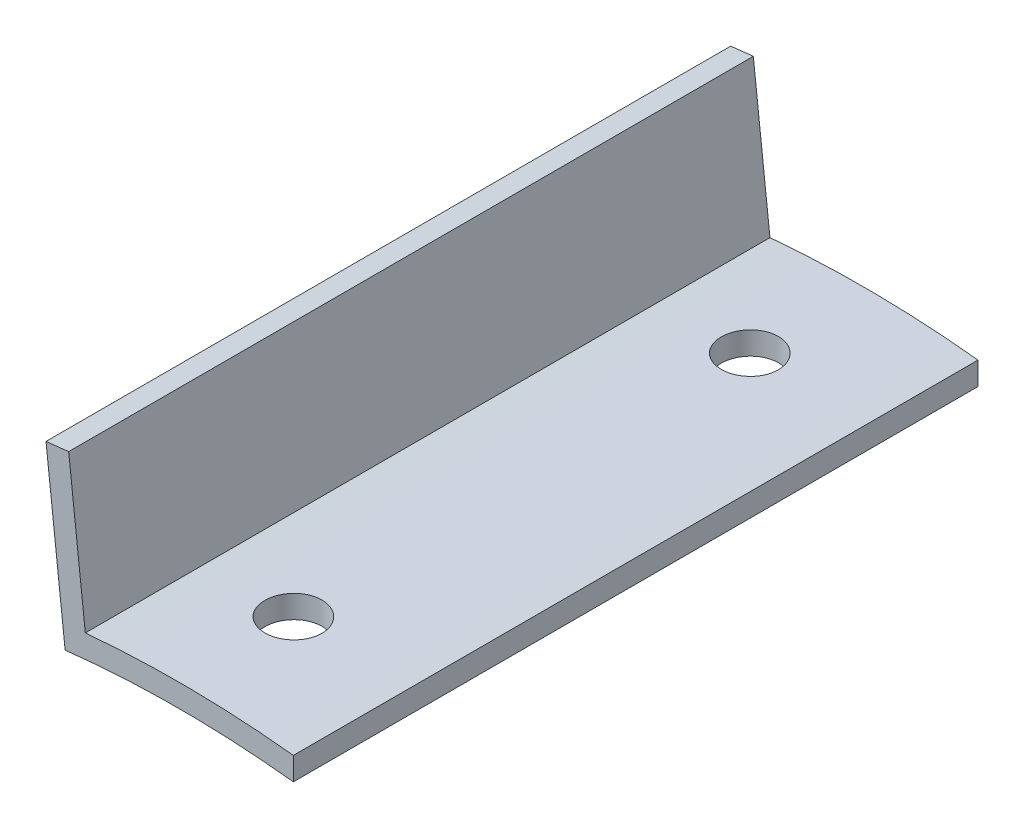
ISO-10303-21;
HEADER;
FILE_DESCRIPTION(('STEP AP214'),'2;1');
FILE_NAME('part.step','',(''),(''),'','','');
FILE_SCHEMA(('AUTOMOTIVE_DESIGN { 1 0 10303 214 1 1 1 1 }'));
ENDSEC;
DATA;
#1=APPLICATION_CONTEXT('core data for automotive mechanical design processes');
#2=APPLICATION_PROTOCOL_DEFINITION('international standard','automotive_design',2000,#1);
#3=PRODUCT_CONTEXT('',#1,'mechanical');
#4=PRODUCT('Part','Part','',(#3));
#5=PRODUCT_RELATED_PRODUCT_CATEGORY('part','',(#4));
#6=PRODUCT_DEFINITION_FORMATION('','',#4);
#7=PRODUCT_DEFINITION_CONTEXT('part definition',#1,'design');
#8=PRODUCT_DEFINITION('design','',#6,#7);
#9=PRODUCT_DEFINITION_SHAPE('','',#8);
#10=(LENGTH_UNIT() NAMED_UNIT(*) SI_UNIT(.MILLI.,.METRE.));
#11=(NAMED_UNIT(*) PLANE_ANGLE_UNIT() SI_UNIT($,.RADIAN.));
#12=(NAMED_UNIT(*) SI_UNIT($,.STERADIAN.) SOLID_ANGLE_UNIT());
#13=UNCERTAINTY_MEASURE_WITH_UNIT(LENGTH_MEASURE(1.E-05),#10,'distance_accuracy_value','');
#14=(GEOMETRIC_REPRESENTATION_CONTEXT(3) GLOBAL_UNCERTAINTY_ASSIGNED_CONTEXT((#13)) GLOBAL_UNIT_ASSIGNED_CONTEXT((#10,
#11,#12)) REPRESENTATION_CONTEXT('',''));
#15=CARTESIAN_POINT('',(0.,0.,0.));
#16=DIRECTION('',(0.,0.,1.));
#17=DIRECTION('',(1.,0.,0.));
#18=AXIS2_PLACEMENT_3D('',#15,#16,#17);
#19=CARTESIAN_POINT('',(0.,0.,76.2));
#20=DIRECTION('',(0.,0.,-1.));
#21=DIRECTION('',(-1.,0.,0.));
#22=AXIS2_PLACEMENT_3D('',#19,#20,#21);
#23=CYLINDRICAL_SURFACE('',#22,114.3);
#24=CARTESIAN_POINT('',(0.,0.,0.));
#25=DIRECTION('',(0.,0.,-1.));
#26=DIRECTION('',(1.,0.,0.));
#27=AXIS2_PLACEMENT_3D('',#24,#25,#26);
#28=CIRCLE('',#27,114.3);
#29=CARTESIAN_POINT('',(-12.7,113.592253256989,0.));
#30=VERTEX_POINT('',#29);
#31=CARTESIAN_POINT('',(12.7,113.592253256989,0.));
#32=VERTEX_POINT('',#31);
#33=EDGE_CURVE('E129',#30,#32,#28,.T.);
#34=ORIENTED_EDGE('',*,*,#33,.T.);
#35=DIRECTION('',(0.,0.,-1.));
#36=VECTOR('',#35,1.);
#37=CARTESIAN_POINT('',(12.7,113.592253256989,76.2));
#38=LINE('',#37,#36);
#39=CARTESIAN_POINT('',(12.7,113.592253256989,76.2));
#40=VERTEX_POINT('',#39);
#41=EDGE_CURVE('E11',#40,#32,#38,.T.);
#42=ORIENTED_EDGE('',*,*,#41,.F.);
#43=CARTESIAN_POINT('',(0.,0.,76.2));
#44=DIRECTION('',(0.,0.,-1.));
#45=DIRECTION('',(1.,0.,0.));
#46=AXIS2_PLACEMENT_3D('',#43,#44,#45);
#47=CIRCLE('',#46,114.3);
#48=CARTESIAN_POINT('',(-12.7,113.592253256989,76.2));
#49=VERTEX_POINT('',#48);
#50=EDGE_CURVE('E140',#49,#40,#47,.T.);
#51=ORIENTED_EDGE('',*,*,#50,.F.);
#52=DIRECTION('',(0.,0.,-1.));
#53=VECTOR('',#52,1.);
#54=CARTESIAN_POINT('',(-12.7,113.592253256989,76.2));
#55=LINE('',#54,#53);
#56=EDGE_CURVE('E125',#49,#30,#55,.T.);
#57=ORIENTED_EDGE('',*,*,#56,.T.);
#58=EDGE_LOOP('',(#34,#42,#51,#57));
#59=FACE_BOUND('',#58,.T.);
#60=CARTESIAN_POINT('',(0.,114.3,60.325));
#61=CARTESIAN_POINT('',(0.178304243364314,114.299999405569,60.3250078957629));
#62=CARTESIAN_POINT('',(0.356736898466203,114.299578300448,60.3400704468751));
#63=CARTESIAN_POINT('',(0.708685549625588,114.297938910975,60.3999475136547));
#64=CARTESIAN_POINT('',(0.882195407258941,114.296719673371,60.4447976070695));
#65=CARTESIAN_POINT('',(1.2191488431536,114.293622100607,60.562969723653));
#66=CARTESIAN_POINT('',(1.38259728423446,114.29174408683,60.6362778654779));
#67=CARTESIAN_POINT('',(1.69482204221795,114.287540823839,60.8092653394358));
#68=CARTESIAN_POINT('',(1.84360193806812,114.28521568413,60.9089382169254));
#69=CARTESIAN_POINT('',(2.12237339241983,114.280378926487,61.1318743818417));
#70=CARTESIAN_POINT('',(2.25235844206779,114.277867244406,61.2551458075125));
#71=CARTESIAN_POINT('',(2.4897958053313,114.272941052429,61.5217660932444));
#72=CARTESIAN_POINT('',(2.59724722334341,114.270526546399,61.6651157509412));
#73=CARTESIAN_POINT('',(2.78657573933242,114.266066694851,61.9678454451334));
#74=CARTESIAN_POINT('',(2.86844917368285,114.264021402236,62.1272277737277));
#75=CARTESIAN_POINT('',(3.00427368605122,114.260531165424,62.457482137534));
#76=CARTESIAN_POINT('',(3.05822486809455,114.259086218992,62.6283541299382));
#77=CARTESIAN_POINT('',(3.13666007533643,114.25696004588,62.9766904801625));
#78=CARTESIAN_POINT('',(3.16115174705949,114.256278621025,63.1541531149787));
#79=CARTESIAN_POINT('',(3.17999624937449,114.25575572758,63.5106721733828));
#80=CARTESIAN_POINT('',(3.17434919085895,114.255914255901,63.6897285911041));
#81=CARTESIAN_POINT('',(3.13308302696788,114.257053207266,64.0443005771734));
#82=CARTESIAN_POINT('',(3.09747219532296,114.258033403428,64.2198171092728));
#83=CARTESIAN_POINT('',(2.99730213846072,114.260704834522,64.5623797991108));
#84=CARTESIAN_POINT('',(2.93274285424056,114.262396070903,64.7294259395843));
#85=CARTESIAN_POINT('',(2.77649900518577,114.266299189412,65.0503325735266));
#86=CARTESIAN_POINT('',(2.6848106470623,114.268511144341,65.2041912191879));
#87=CARTESIAN_POINT('',(2.47691418847677,114.27320626575,65.4943350714013));
#88=CARTESIAN_POINT('',(2.36070604139611,114.275689432747,65.630620244541));
#89=CARTESIAN_POINT('',(2.1070219146607,114.280648057349,65.8817967258026));
#90=CARTESIAN_POINT('',(1.96953875786254,114.283123512064,65.9966807853099));
#91=CARTESIAN_POINT('',(1.67723260093752,114.287786838909,66.201738075905));
#92=CARTESIAN_POINT('',(1.52240959808937,114.289974710993,66.2919113031147));
#93=CARTESIAN_POINT('',(1.19981463380222,114.293816261226,66.4449863978473));
#94=CARTESIAN_POINT('',(1.0320425652132,114.295469934953,66.5078880396766));
#95=CARTESIAN_POINT('',(0.688313751075904,114.298056601011,66.6046297840197));
#96=CARTESIAN_POINT('',(0.512357024681352,114.298989595028,66.6384699545393));
#97=CARTESIAN_POINT('',(0.157316686307196,114.30002951295,66.6761192739327));
#98=CARTESIAN_POINT('',(-0.0217658613824852,114.300136712729,66.6799384519926));
#99=CARTESIAN_POINT('',(-0.378029616769707,114.299513688525,66.6574635058801));
#100=CARTESIAN_POINT('',(-0.555210826343559,114.298783465368,66.6311694114273));
#101=CARTESIAN_POINT('',(-0.902614389423197,114.2965680745,66.5492226182907));
#102=CARTESIAN_POINT('',(-1.07283781733698,114.295083023827,66.4935744710013));
#103=CARTESIAN_POINT('',(-1.40152673456447,114.291525332987,66.3545038513448));
#104=CARTESIAN_POINT('',(-1.55999220383978,114.289452691818,66.2710813316448));
#105=CARTESIAN_POINT('',(-1.8607130896797,114.284952645515,66.0788042089193));
#106=CARTESIAN_POINT('',(-2.00296418817766,114.28252514627,65.9699428546832));
#107=CARTESIAN_POINT('',(-2.26717496752364,114.277589291076,65.7298881625925));
#108=CARTESIAN_POINT('',(-2.38913460276111,114.275080934946,65.5986947745419));
#109=CARTESIAN_POINT('',(-2.60933390680709,114.270265358913,65.3176571709751));
#110=CARTESIAN_POINT('',(-2.70756710425557,114.267958193994,65.1678078839337));
#111=CARTESIAN_POINT('',(-2.87748077665022,114.263805988154,64.8537381057858));
#112=CARTESIAN_POINT('',(-2.94916130689176,114.261960946271,64.6895176446077));
#113=CARTESIAN_POINT('',(-3.06392356916353,114.258941402434,64.3513915336893));
#114=CARTESIAN_POINT('',(-3.10700949455481,114.257766802164,64.1774873081162));
#115=CARTESIAN_POINT('',(-3.1633732487292,114.256220297756,63.8249099448361));
#116=CARTESIAN_POINT('',(-3.17665109232061,114.255848393218,63.6462368094982));
#117=CARTESIAN_POINT('',(-3.17302127212727,114.25594924722,63.2892584019671));
#118=CARTESIAN_POINT('',(-3.15612382266086,114.256421719938,63.110953025741));
#119=CARTESIAN_POINT('',(-3.09264405984201,114.258157464831,62.7597109079791));
#120=CARTESIAN_POINT('',(-3.04606168750461,114.259420738578,62.5867741771117));
#121=CARTESIAN_POINT('',(-2.92453562217874,114.262595635698,62.2511740738268));
#122=CARTESIAN_POINT('',(-2.84959144356336,114.264507270174,62.0885108773743));
#123=CARTESIAN_POINT('',(-2.67347314348552,114.26876330027,61.7780792280605));
#124=CARTESIAN_POINT('',(-2.57229998216587,114.271107680049,61.6303102302544));
#125=CARTESIAN_POINT('',(-2.34656736869079,114.275965685524,61.3538157693356));
#126=CARTESIAN_POINT('',(-2.22200249636295,114.27847935036,61.2250947322753));
#127=CARTESIAN_POINT('',(-1.95299433429601,114.283392801243,60.9903570692654));
#128=CARTESIAN_POINT('',(-1.80854612741083,114.285792558924,60.8843460761358));
#129=CARTESIAN_POINT('',(-1.50381964261901,114.290208440735,60.6980222424245));
#130=CARTESIAN_POINT('',(-1.3435315469773,114.292224324643,60.6177254721916));
#131=CARTESIAN_POINT('',(-1.0118678271436,114.295640825866,60.4852758067331));
#132=CARTESIAN_POINT('',(-0.840505709764128,114.297042177054,60.4330893252332));
#133=CARTESIAN_POINT('',(-0.556716454598892,114.298696869394,60.3721827773865));
#134=CARTESIAN_POINT('',(-0.446131625139348,114.299183425209,60.3545114732344));
#135=CARTESIAN_POINT('',(-0.223714716898868,114.299835176969,60.3309176087967));
#136=CARTESIAN_POINT('',(-0.111882638431884,114.300000372995,60.3249950455538));
#137=CARTESIAN_POINT('',(0.,114.3,60.325));
#138=B_SPLINE_CURVE_WITH_KNOTS('',3,(#60,#61,#62,#63,#64,#65,#66,#67,#68,#69,#70,#71,#72,#73,
#74,#75,#76,#77,#78,#79,#80,#81,#82,#83,#84,#85,#86,#87,#88,#89,#90,#91,#92,#93,#94,#95,#96,#97,
#98,#99,#100,#101,#102,#103,#104,#105,#106,#107,#108,#109,#110,#111,#112,#113,#114,#115,#116,
#117,#118,#119,#120,#121,#122,#123,#124,#125,#126,#127,#128,#129,#130,#131,#132,#133,#134,#135,
#136,#137),.UNSPECIFIED.,.T.,.F.,(4,2,2,2,2,2,2,2,2,2,2,2,2,2,2,2,2,2,2,2,2,2,2,2,2,2,2,2,2,2,2,
2,2,2,2,2,2,2,4),(0.,0.534504346040704,1.06964824605864,1.60453143947549,2.13928380321481,
2.67422091605884,3.20917928605177,3.74421424496015,4.2792472105615,4.81414127276365,
5.34903336687665,5.88377781265055,6.41852334834754,6.95334368953262,7.48816504756163,
8.02316722296619,8.55816948233354,9.09317616917473,9.62818160405718,10.16300830077,
10.6978344696474,11.2325777372082,11.7673219160792,12.3022081721647,12.8370956305355,
13.3721288145472,13.9071608843569,14.4421144750719,14.9770678000283,15.5118400779327,
16.0466134184512,16.581395916076,17.1161588401209,17.6510458291293,18.1860653340669,
18.7214185549551,19.2561307070241,19.5915224532475,19.9269141150497),.UNSPECIFIED.);
#139=CARTESIAN_POINT('',(0.,114.3,60.325));
#140=VERTEX_POINT('',#139);
#141=EDGE_CURVE('E151',#140,#140,#138,.T.);
#142=ORIENTED_EDGE('',*,*,#141,.F.);
#143=EDGE_LOOP('',(#142));
#144=FACE_BOUND('',#143,.T.);
#145=CARTESIAN_POINT('',(0.,114.3,9.525));
#146=CARTESIAN_POINT('',(0.178304243364308,114.299999405569,9.52500789576287));
#147=CARTESIAN_POINT('',(0.356736898466197,114.299578300448,9.54007044687507));
#148=CARTESIAN_POINT('',(0.708685549625582,114.297938910975,9.59994751365464));
#149=CARTESIAN_POINT('',(0.882195407258935,114.296719673371,9.64479760706949));
#150=CARTESIAN_POINT('',(1.2191488431536,114.293622100607,9.76296972365296));
#151=CARTESIAN_POINT('',(1.38259728423446,114.29174408683,9.83627786547792));
#152=CARTESIAN_POINT('',(1.69482204221795,114.287540823839,10.0092653394357));
#153=CARTESIAN_POINT('',(1.84360193806811,114.28521568413,10.1089382169253));
#154=CARTESIAN_POINT('',(2.12237339241982,114.280378926487,10.3318743818417));
#155=CARTESIAN_POINT('',(2.25235844206778,114.277867244406,10.4551458075125));
#156=CARTESIAN_POINT('',(2.4897958053313,114.272941052429,10.7217660932444));
#157=CARTESIAN_POINT('',(2.5972472233434,114.270526546399,10.8651157509412));
#158=CARTESIAN_POINT('',(2.78657573933242,114.266066694851,11.1678454451334));
#159=CARTESIAN_POINT('',(2.86844917368285,114.264021402236,11.3272277737277));
#160=CARTESIAN_POINT('',(3.00427368605122,114.260531165424,11.657482137534));
#161=CARTESIAN_POINT('',(3.05822486809455,114.259086218992,11.8283541299382));
#162=CARTESIAN_POINT('',(3.13666007533643,114.25696004588,12.1766904801625));
#163=CARTESIAN_POINT('',(3.16115174705949,114.256278621025,12.3541531149787));
#164=CARTESIAN_POINT('',(3.17999624937449,114.25575572758,12.7106721733828));
#165=CARTESIAN_POINT('',(3.17434919085895,114.255914255901,12.8897285911041));
#166=CARTESIAN_POINT('',(3.13308302696788,114.257053207266,13.2443005771734));
#167=CARTESIAN_POINT('',(3.09747219532295,114.258033403428,13.4198171092727));
#168=CARTESIAN_POINT('',(2.99730213846072,114.260704834522,13.7623797991108));
#169=CARTESIAN_POINT('',(2.93274285424055,114.262396070903,13.9294259395844));
#170=CARTESIAN_POINT('',(2.77649900518576,114.266299189412,14.2503325735267));
#171=CARTESIAN_POINT('',(2.68481064706228,114.268511144341,14.4041912191879));
#172=CARTESIAN_POINT('',(2.47691418847676,114.27320626575,14.6943350714013));
#173=CARTESIAN_POINT('',(2.3607060413961,114.275689432747,14.830620244541));
#174=CARTESIAN_POINT('',(2.10702191466069,114.280648057349,15.0817967258026));
#175=CARTESIAN_POINT('',(1.96953875786253,114.283123512064,15.1966807853099));
#176=CARTESIAN_POINT('',(1.67723260093752,114.287786838909,15.401738075905));
#177=CARTESIAN_POINT('',(1.52240959808937,114.289974710993,15.4919113031147));
#178=CARTESIAN_POINT('',(1.19981463380222,114.293816261226,15.6449863978473));
#179=CARTESIAN_POINT('',(1.0320425652132,114.295469934953,15.7078880396766));
#180=CARTESIAN_POINT('',(0.688313751075902,114.298056601011,15.8046297840197));
#181=CARTESIAN_POINT('',(0.512357024681349,114.298989595028,15.8384699545393));
#182=CARTESIAN_POINT('',(0.157316686307193,114.30002951295,15.8761192739327));
#183=CARTESIAN_POINT('',(-0.0217658613824892,114.300136712729,15.8799384519926));
#184=CARTESIAN_POINT('',(-0.378029616769712,114.299513688525,15.8574635058801));
#185=CARTESIAN_POINT('',(-0.555210826343564,114.298783465368,15.8311694114273));
#186=CARTESIAN_POINT('',(-0.902614389423204,114.2965680745,15.7492226182907));
#187=CARTESIAN_POINT('',(-1.07283781733699,114.295083023827,15.6935744710013));
#188=CARTESIAN_POINT('',(-1.40152673456448,114.291525332987,15.5545038513448));
#189=CARTESIAN_POINT('',(-1.55999220383979,114.289452691818,15.4710813316448));
#190=CARTESIAN_POINT('',(-1.86071308967971,114.284952645515,15.2788042089193));
#191=CARTESIAN_POINT('',(-2.00296418817766,114.28252514627,15.1699428546832));
#192=CARTESIAN_POINT('',(-2.26717496752364,114.277589291076,14.9298881625925));
#193=CARTESIAN_POINT('',(-2.38913460276111,114.275080934946,14.7986947745419));
#194=CARTESIAN_POINT('',(-2.60933390680709,114.270265358913,14.5176571709751));
#195=CARTESIAN_POINT('',(-2.70756710425557,114.267958193994,14.3678078839338));
#196=CARTESIAN_POINT('',(-2.87748077665022,114.263805988154,14.0537381057858));
#197=CARTESIAN_POINT('',(-2.94916130689177,114.261960946271,13.8895176446078));
#198=CARTESIAN_POINT('',(-3.06392356916354,114.258941402434,13.5513915336893));
#199=CARTESIAN_POINT('',(-3.10700949455482,114.257766802164,13.3774873081162));
#200=CARTESIAN_POINT('',(-3.16337324872921,114.256220297756,13.0249099448361));
#201=CARTESIAN_POINT('',(-3.17665109232062,114.255848393218,12.8462368094982));
#202=CARTESIAN_POINT('',(-3.17302127212728,114.25594924722,12.4892584019671));
#203=CARTESIAN_POINT('',(-3.15612382266087,114.256421719938,12.310953025741));
#204=CARTESIAN_POINT('',(-3.09264405984202,114.258157464831,11.9597109079791));
#205=CARTESIAN_POINT('',(-3.04606168750462,114.259420738578,11.7867741771116));
#206=CARTESIAN_POINT('',(-2.92453562217875,114.262595635698,11.4511740738268));
#207=CARTESIAN_POINT('',(-2.84959144356337,114.264507270174,11.2885108773743));
#208=CARTESIAN_POINT('',(-2.67347314348553,114.26876330027,10.9780792280605));
#209=CARTESIAN_POINT('',(-2.57229998216588,114.271107680049,10.8303102302544));
#210=CARTESIAN_POINT('',(-2.34656736869079,114.275965685524,10.5538157693356));
#211=CARTESIAN_POINT('',(-2.22200249636296,114.27847935036,10.4250947322753));
#212=CARTESIAN_POINT('',(-1.95299433429602,114.283392801243,10.1903570692654));
#213=CARTESIAN_POINT('',(-1.80854612741084,114.285792558924,10.0843460761358));
#214=CARTESIAN_POINT('',(-1.50381964261902,114.290208440735,9.89802224242452));
#215=CARTESIAN_POINT('',(-1.34353154697731,114.292224324643,9.81772547219164));
#216=CARTESIAN_POINT('',(-1.01186782714361,114.295640825866,9.6852758067331));
#217=CARTESIAN_POINT('',(-0.840505709764133,114.297042177054,9.63308932523319));
#218=CARTESIAN_POINT('',(-0.556716454598898,114.298696869394,9.5721827773865));
#219=CARTESIAN_POINT('',(-0.446131625139354,114.299183425209,9.55451147323443));
#220=CARTESIAN_POINT('',(-0.223714716898875,114.299835176969,9.53091760879671));
#221=CARTESIAN_POINT('',(-0.111882638431891,114.300000372995,9.5249950455538));
#222=CARTESIAN_POINT('',(0.,114.3,9.525));
#223=B_SPLINE_CURVE_WITH_KNOTS('',3,(#145,#146,#147,#148,#149,#150,#151,#152,#153,#154,#155,
#156,#157,#158,#159,#160,#161,#162,#163,#164,#165,#166,#167,#168,#169,#170,#171,#172,#173,#174,
#175,#176,#177,#178,#179,#180,#181,#182,#183,#184,#185,#186,#187,#188,#189,#190,#191,#192,#193,
#194,#195,#196,#197,#198,#199,#200,#201,#202,#203,#204,#205,#206,#207,#208,#209,#210,#211,#212,
#213,#214,#215,#216,#217,#218,#219,#220,#221,#222),.UNSPECIFIED.,.T.,.F.,(4,2,2,2,2,2,2,2,2,2,2,
2,2,2,2,2,2,2,2,2,2,2,2,2,2,2,2,2,2,2,2,2,2,2,2,2,2,2,4),(0.,0.534504346040704,1.06964824605864,
1.6045314394755,2.13928380321482,2.67422091605884,3.20917928605177,3.74421424496015,
4.27924721056151,4.81414127276365,5.34903336687665,5.88377781265056,6.41852334834756,
6.95334368953264,7.48816504756165,8.0231672229662,8.55816948233354,9.09317616917473,
9.62818160405719,10.16300830077,10.6978344696474,11.2325777372082,11.7673219160792,
12.3022081721647,12.8370956305355,13.3721288145472,13.9071608843569,14.442114475072,
14.9770678000284,15.5118400779327,16.0466134184513,16.581395916076,17.116158840121,
17.6510458291293,18.186065334067,18.7214185549551,19.2561307070241,19.5915224532475,
19.9269141150497),.UNSPECIFIED.);
#224=CARTESIAN_POINT('',(0.,114.3,9.525));
#225=VERTEX_POINT('',#224);
#226=EDGE_CURVE('E133',#225,#225,#223,.T.);
#227=ORIENTED_EDGE('',*,*,#226,.F.);
#228=EDGE_LOOP('',(#227));
#229=FACE_BOUND('',#228,.T.);
#230=ADVANCED_FACE('F37',(#59,#144,#229),#23,.F.);
#231=CARTESIAN_POINT('',(0.,0.,76.2));
#232=DIRECTION('',(0.,0.,-1.));
#233=DIRECTION('',(-1.,0.,0.));
#234=AXIS2_PLACEMENT_3D('',#231,#232,#233);
#235=CYLINDRICAL_SURFACE('',#234,116.84);
#236=CARTESIAN_POINT('',(0.,0.,0.));
#237=DIRECTION('',(0.,0.,1.));
#238=DIRECTION('',(-1.,0.,0.));
#239=AXIS2_PLACEMENT_3D('',#236,#237,#238);
#240=CIRCLE('',#239,116.84);
#241=CARTESIAN_POINT('',(12.7,116.147731790165,0.));
#242=VERTEX_POINT('',#241);
#243=CARTESIAN_POINT('',(-10.4548819322535,116.371306789013,0.));
#244=VERTEX_POINT('',#243);
#245=EDGE_CURVE('E135',#242,#244,#240,.T.);
#246=ORIENTED_EDGE('',*,*,#245,.T.);
#247=DIRECTION('',(0.,0.,-1.));
#248=VECTOR('',#247,1.);
#249=CARTESIAN_POINT('',(-10.4548819322535,116.371306789013,76.2));
#250=LINE('',#249,#248);
#251=CARTESIAN_POINT('',(-10.4548819322535,116.371306789013,76.2));
#252=VERTEX_POINT('',#251);
#253=EDGE_CURVE('E120',#252,#244,#250,.T.);
#254=ORIENTED_EDGE('',*,*,#253,.F.);
#255=CARTESIAN_POINT('',(0.,0.,76.2));
#256=DIRECTION('',(0.,0.,1.));
#257=DIRECTION('',(-1.,0.,0.));
#258=AXIS2_PLACEMENT_3D('',#255,#256,#257);
#259=CIRCLE('',#258,116.84);
#260=CARTESIAN_POINT('',(12.7,116.147731790165,76.2));
#261=VERTEX_POINT('',#260);
#262=EDGE_CURVE('E111',#261,#252,#259,.T.);
#263=ORIENTED_EDGE('',*,*,#262,.F.);
#264=DIRECTION('',(0.,0.,-1.));
#265=VECTOR('',#264,1.);
#266=CARTESIAN_POINT('',(12.7,116.147731790165,76.2));
#267=LINE('',#266,#265);
#268=EDGE_CURVE('E52',#261,#242,#267,.T.);
#269=ORIENTED_EDGE('',*,*,#268,.T.);
#270=EDGE_LOOP('',(#246,#254,#263,#269));
#271=FACE_BOUND('',#270,.T.);
#272=CARTESIAN_POINT('',(0.,116.84,60.325));
#273=CARTESIAN_POINT('',(-0.178305829835271,116.839999418409,60.3250078963186));
#274=CARTESIAN_POINT('',(-0.356740110221131,116.83958746034,60.3400707144178));
#275=CARTESIAN_POINT('',(-0.708692075975887,116.837983680916,60.3999489034991));
#276=CARTESIAN_POINT('',(-0.88220362119015,116.836790926752,60.4447998629689));
#277=CARTESIAN_POINT('',(-1.21916044072743,116.833760639084,60.5629744152511));
#278=CARTESIAN_POINT('',(-1.38261057366246,116.831923419707,60.6362841384867));
#279=CARTESIAN_POINT('',(-1.69483838006871,116.827811468272,60.8092754813773));
#280=CARTESIAN_POINT('',(-1.84361963500969,116.825536843411,60.9089506417999));
#281=CARTESIAN_POINT('',(-2.12239175252469,116.820805207347,61.1318907928438));
#282=CARTESIAN_POINT('',(-2.25237630107357,116.818348135277,61.2551636780434));
#283=CARTESIAN_POINT('',(-2.48981229757796,116.813529071875,61.5217867964462));
#284=CARTESIAN_POINT('',(-2.59726285038103,116.811167084324,61.6651378268672));
#285=CARTESIAN_POINT('',(-2.78658858409362,116.806804278628,61.9678688954406));
#286=CARTESIAN_POINT('',(-2.8684602796852,116.804803509717,62.1272511140591));
#287=CARTESIAN_POINT('',(-3.00428144722538,116.801389269168,62.457504672822));
#288=CARTESIAN_POINT('',(-3.05823102113635,116.799975795384,62.6283759710095));
#289=CARTESIAN_POINT('',(-3.13666377733815,116.797895938131,62.9767124053353));
#290=CARTESIAN_POINT('',(-3.16115427504861,116.79722936919,63.1541758931807));
#291=CARTESIAN_POINT('',(-3.17999620572558,116.796717921041,63.5106963995518));
#292=CARTESIAN_POINT('',(-3.17434774715087,116.796873038876,63.6897534123407));
#293=CARTESIAN_POINT('',(-3.13307832554993,116.79798729915,64.0443285582711));
#294=CARTESIAN_POINT('',(-3.09746527970894,116.798946229207,64.2198476136627));
#295=CARTESIAN_POINT('',(-2.99728984710185,116.801559677755,64.5624149775999));
#296=CARTESIAN_POINT('',(-2.932727402552,116.803214197634,64.729463269237));
#297=CARTESIAN_POINT('',(-2.77647678497772,116.80703255438,65.0503726154293));
#298=CARTESIAN_POINT('',(-2.68478498185203,116.809196459398,65.2042319016461));
#299=CARTESIAN_POINT('',(-2.47688116565867,116.813789572827,65.4943762935596));
#300=CARTESIAN_POINT('',(-2.36066910840196,116.816218781716,65.6306613675844));
#301=CARTESIAN_POINT('',(-2.10697881919996,116.821069599166,65.8818348372085));
#302=CARTESIAN_POINT('',(-1.96949371879301,116.823491205013,65.9967162956897));
#303=CARTESIAN_POINT('',(-1.67718430230824,116.828053064282,66.2017680421166));
#304=CARTESIAN_POINT('',(-1.52235998353178,116.830193317659,66.2919383262161));
#305=CARTESIAN_POINT('',(-1.19976323214845,116.833951225739,66.4450073070155));
#306=CARTESIAN_POINT('',(-1.03199069725869,116.835568876314,66.5079057882589));
#307=CARTESIAN_POINT('',(-0.688261732225045,116.8380991558,66.6046412732251));
#308=CARTESIAN_POINT('',(-0.512305320424976,116.839011786291,66.6384783420846));
#309=CARTESIAN_POINT('',(-0.157263680285628,116.840028945567,66.6761219902021));
#310=CARTESIAN_POINT('',(0.021820529695659,116.840133732631,66.6799381675934));
#311=CARTESIAN_POINT('',(0.378087113045128,116.839524076681,66.6574567133713));
#312=CARTESIAN_POINT('',(0.555269488205627,116.838809634439,66.6311591101401));
#313=CARTESIAN_POINT('',(0.902676053957727,116.83664221019,66.5492045358561));
#314=CARTESIAN_POINT('',(1.07290127270459,116.835189337739,66.4935519200276));
#315=CARTESIAN_POINT('',(1.4015929670541,116.831708784919,66.3544715287457));
#316=CARTESIAN_POINT('',(1.56005942354105,116.829681103614,66.2710437081406));
#317=CARTESIAN_POINT('',(1.86077946645718,116.825278743824,66.0787564087549));
#318=CARTESIAN_POINT('',(2.00302891997364,116.822903977234,65.9698904685162));
#319=CARTESIAN_POINT('',(2.26723549805402,116.818075394584,65.7298267357555));
#320=CARTESIAN_POINT('',(2.38919257861834,116.815621578352,65.5986288948128));
#321=CARTESIAN_POINT('',(2.60938448760782,116.810910791868,65.3175844950707));
#322=CARTESIAN_POINT('',(2.70761312290446,116.808653873104,65.1677330831168));
#323=CARTESIAN_POINT('',(2.87751741262019,116.804592148902,64.8536601222026));
#324=CARTESIAN_POINT('',(2.94919312116716,116.802787342543,64.6894386025364));
#325=CARTESIAN_POINT('',(3.06394610747498,116.799833697141,64.3513104309334));
#326=CARTESIAN_POINT('',(3.10702739972657,116.798684766019,64.1774051422593));
#327=CARTESIAN_POINT('',(3.16338180141117,116.797172150365,63.824826592564));
#328=CARTESIAN_POINT('',(3.17665492270043,116.79680846552,63.6461533334392));
#329=CARTESIAN_POINT('',(3.17301572247659,116.796907380387,63.2891728615552));
#330=CARTESIAN_POINT('',(3.15611317812223,116.797369712463,63.110865548966));
#331=CARTESIAN_POINT('',(3.09262253147727,116.799067978854,62.7596203822523));
#332=CARTESIAN_POINT('',(3.04603437016517,116.800303914706,62.5866825388042));
#333=CARTESIAN_POINT('',(2.9244960967796,116.803410023969,62.2510811319982));
#334=CARTESIAN_POINT('',(2.84954549620467,116.805280208303,62.0884177456591));
#335=CARTESIAN_POINT('',(2.67341387180267,116.80944389931,61.7779869040423));
#336=CARTESIAN_POINT('',(2.57223381113176,116.811737390438,61.6302189020769));
#337=CARTESIAN_POINT('',(2.3464888493733,116.81648985827,61.3537298792168));
#338=CARTESIAN_POINT('',(2.22191886625767,116.818948870864,61.2250130085318));
#339=CARTESIAN_POINT('',(1.95290124372581,116.823755438581,60.9902845922936));
#340=CARTESIAN_POINT('',(1.80844868667479,116.826102965937,60.8842786805651));
#341=CARTESIAN_POINT('',(1.5037155476428,116.830422661051,60.697966423291));
#342=CARTESIAN_POINT('',(1.3434252482271,116.832394596161,60.6176759855189));
#343=CARTESIAN_POINT('',(1.0117585445392,116.835736541957,60.4852391897309));
#344=CARTESIAN_POINT('',(0.840395648078501,116.837107270741,60.4330592386051));
#345=CARTESIAN_POINT('',(0.556623784224136,116.838725623712,60.3721669548336));
#346=CARTESIAN_POINT('',(0.446057087065367,116.839201443946,60.3545015699767));
#347=CARTESIAN_POINT('',(0.223677112187267,116.839838814489,60.3309156170141));
#348=CARTESIAN_POINT('',(0.111863834767963,116.840000364873,60.3249950460819));
#349=CARTESIAN_POINT('',(0.,116.84,60.325));
#350=B_SPLINE_CURVE_WITH_KNOTS('',3,(#272,#273,#274,#275,#276,#277,#278,#279,#280,#281,#282,
#283,#284,#285,#286,#287,#288,#289,#290,#291,#292,#293,#294,#295,#296,#297,#298,#299,#300,#301,
#302,#303,#304,#305,#306,#307,#308,#309,#310,#311,#312,#313,#314,#315,#316,#317,#318,#319,#320,
#321,#322,#323,#324,#325,#326,#327,#328,#329,#330,#331,#332,#333,#334,#335,#336,#337,#338,#339,
#340,#341,#342,#343,#344,#345,#346,#347,#348,#349),.UNSPECIFIED.,.T.,.F.,(4,2,2,2,2,2,2,2,2,2,2,
2,2,2,2,2,2,2,2,2,2,2,2,2,2,2,2,2,2,2,2,2,2,2,2,2,2,2,4),(0.,0.534509174640611,1.0696580895617,
1.60454652269547,2.13930403541901,2.67424076400375,3.20919873867601,3.74422957376823,
4.27925845509061,4.81415444801907,5.34904851605912,5.8838012997884,6.41855515090254,
6.95338058827252,7.48820698948375,8.02320643267851,8.55820595914007,9.09320971219925,
9.62821226612724,10.1630437646895,10.6978747591747,11.2326264263551,11.7673789628386,
12.302267478099,12.8371571531341,13.3721862839964,13.9072143242008,14.4421672336643,
14.9771199303493,15.5118993295073,16.0466797919268,16.5814694655754,17.1162395043162,
17.6511258695564,18.1861447688616,18.7214939982359,19.2562020375217,19.5915374577917,
19.9268727973552),.UNSPECIFIED.);
#351=CARTESIAN_POINT('',(0.,116.84,60.325));
#352=VERTEX_POINT('',#351);
#353=EDGE_CURVE('E145',#352,#352,#350,.T.);
#354=ORIENTED_EDGE('',*,*,#353,.F.);
#355=EDGE_LOOP('',(#354));
#356=FACE_BOUND('',#355,.T.);
#357=CARTESIAN_POINT('',(0.,116.84,9.525));
#358=CARTESIAN_POINT('',(-0.178305829835277,116.839999418409,9.52500789631861));
#359=CARTESIAN_POINT('',(-0.356740110221137,116.83958746034,9.54007071441778));
#360=CARTESIAN_POINT('',(-0.708692075975893,116.837983680916,9.59994890349914));
#361=CARTESIAN_POINT('',(-0.882203621190157,116.836790926752,9.64479986296887));
#362=CARTESIAN_POINT('',(-1.21916044072743,116.833760639084,9.76297441525108));
#363=CARTESIAN_POINT('',(-1.38261057366247,116.831923419707,9.8362841384867));
#364=CARTESIAN_POINT('',(-1.69483838006871,116.827811468272,10.0092754813773));
#365=CARTESIAN_POINT('',(-1.8436196350097,116.825536843411,10.1089506417999));
#366=CARTESIAN_POINT('',(-2.1223917525247,116.820805207347,10.3318907928438));
#367=CARTESIAN_POINT('',(-2.25237630107358,116.818348135277,10.4551636780434));
#368=CARTESIAN_POINT('',(-2.48981229757797,116.813529071875,10.7217867964462));
#369=CARTESIAN_POINT('',(-2.59726285038104,116.811167084324,10.8651378268672));
#370=CARTESIAN_POINT('',(-2.78658858409362,116.806804278628,11.1678688954406));
#371=CARTESIAN_POINT('',(-2.8684602796852,116.804803509717,11.3272511140591));
#372=CARTESIAN_POINT('',(-3.00428144722538,116.801389269168,11.657504672822));
#373=CARTESIAN_POINT('',(-3.05823102113636,116.799975795384,11.8283759710094));
#374=CARTESIAN_POINT('',(-3.13666377733816,116.797895938131,12.1767124053353));
#375=CARTESIAN_POINT('',(-3.16115427504862,116.79722936919,12.3541758931807));
#376=CARTESIAN_POINT('',(-3.17999620572559,116.796717921041,12.7106963995518));
#377=CARTESIAN_POINT('',(-3.17434774715088,116.796873038876,12.8897534123407));
#378=CARTESIAN_POINT('',(-3.13307832554994,116.79798729915,13.2443285582711));
#379=CARTESIAN_POINT('',(-3.09746527970895,116.798946229207,13.4198476136627));
#380=CARTESIAN_POINT('',(-2.99728984710185,116.801559677755,13.7624149775999));
#381=CARTESIAN_POINT('',(-2.93272740255201,116.803214197634,13.929463269237));
#382=CARTESIAN_POINT('',(-2.77647678497773,116.80703255438,14.2503726154293));
#383=CARTESIAN_POINT('',(-2.68478498185203,116.809196459398,14.4042319016461));
#384=CARTESIAN_POINT('',(-2.47688116565868,116.813789572827,14.6943762935596));
#385=CARTESIAN_POINT('',(-2.36066910840196,116.816218781716,14.8306613675844));
#386=CARTESIAN_POINT('',(-2.10697881919997,116.821069599166,15.0818348372085));
#387=CARTESIAN_POINT('',(-1.96949371879301,116.823491205013,15.1967162956897));
#388=CARTESIAN_POINT('',(-1.67718430230824,116.828053064282,15.4017680421166));
#389=CARTESIAN_POINT('',(-1.52235998353178,116.830193317659,15.4919383262162));
#390=CARTESIAN_POINT('',(-1.19976323214845,116.833951225739,15.6450073070155));
#391=CARTESIAN_POINT('',(-1.0319906972587,116.835568876314,15.7079057882589));
#392=CARTESIAN_POINT('',(-0.68826173222505,116.8380991558,15.8046412732251));
#393=CARTESIAN_POINT('',(-0.51230532042498,116.839011786291,15.8384783420846));
#394=CARTESIAN_POINT('',(-0.15726368028563,116.840028945567,15.8761219902021));
#395=CARTESIAN_POINT('',(0.0218205296956561,116.840133732631,15.8799381675934));
#396=CARTESIAN_POINT('',(0.378087113045125,116.839524076681,15.8574567133713));
#397=CARTESIAN_POINT('',(0.555269488205623,116.838809634439,15.8311591101401));
#398=CARTESIAN_POINT('',(0.902676053957722,116.83664221019,15.7492045358561));
#399=CARTESIAN_POINT('',(1.07290127270458,116.835189337739,15.6935519200276));
#400=CARTESIAN_POINT('',(1.4015929670541,116.831708784919,15.5544715287457));
#401=CARTESIAN_POINT('',(1.56005942354105,116.829681103614,15.4710437081406));
#402=CARTESIAN_POINT('',(1.86077946645718,116.825278743824,15.2787564087549));
#403=CARTESIAN_POINT('',(2.00302891997363,116.822903977234,15.1698904685162));
#404=CARTESIAN_POINT('',(2.26723549805402,116.818075394584,14.9298267357555));
#405=CARTESIAN_POINT('',(2.38919257861834,116.815621578352,14.7986288948128));
#406=CARTESIAN_POINT('',(2.60938448760782,116.810910791868,14.5175844950707));
#407=CARTESIAN_POINT('',(2.70761312290446,116.808653873104,14.3677330831168));
#408=CARTESIAN_POINT('',(2.87751741262019,116.804592148902,14.0536601222026));
#409=CARTESIAN_POINT('',(2.94919312116715,116.802787342543,13.8894386025363));
#410=CARTESIAN_POINT('',(3.06394610747498,116.799833697141,13.5513104309334));
#411=CARTESIAN_POINT('',(3.10702739972657,116.798684766019,13.3774051422593));
#412=CARTESIAN_POINT('',(3.16338180141117,116.797172150365,13.024826592564));
#413=CARTESIAN_POINT('',(3.17665492270043,116.79680846552,12.8461533334392));
#414=CARTESIAN_POINT('',(3.17301572247658,116.796907380387,12.4891728615552));
#415=CARTESIAN_POINT('',(3.15611317812223,116.797369712463,12.310865548966));
#416=CARTESIAN_POINT('',(3.09262253147726,116.799067978854,11.9596203822523));
#417=CARTESIAN_POINT('',(3.04603437016517,116.800303914706,11.7866825388042));
#418=CARTESIAN_POINT('',(2.92449609677959,116.803410023969,11.4510811319982));
#419=CARTESIAN_POINT('',(2.84954549620466,116.805280208303,11.2884177456591));
#420=CARTESIAN_POINT('',(2.67341387180266,116.80944389931,10.9779869040423));
#421=CARTESIAN_POINT('',(2.57223381113176,116.811737390438,10.8302189020769));
#422=CARTESIAN_POINT('',(2.3464888493733,116.81648985827,10.5537298792168));
#423=CARTESIAN_POINT('',(2.22191886625766,116.818948870864,10.4250130085318));
#424=CARTESIAN_POINT('',(1.95290124372581,116.823755438581,10.1902845922936));
#425=CARTESIAN_POINT('',(1.80844868667478,116.826102965937,10.0842786805651));
#426=CARTESIAN_POINT('',(1.5037155476428,116.830422661051,9.89796642329098));
#427=CARTESIAN_POINT('',(1.34342524822709,116.832394596161,9.8176759855189));
#428=CARTESIAN_POINT('',(1.01175854453919,116.835736541957,9.68523918973088));
#429=CARTESIAN_POINT('',(0.840395648078496,116.837107270741,9.63305923860511));
#430=CARTESIAN_POINT('',(0.556623784224132,116.838725623712,9.57216695483363));
#431=CARTESIAN_POINT('',(0.446057087065363,116.839201443946,9.55450156997666));
#432=CARTESIAN_POINT('',(0.223677112187262,116.839838814489,9.53091561701413));
#433=CARTESIAN_POINT('',(0.111863834767957,116.840000364873,9.52499504608189));
#434=CARTESIAN_POINT('',(0.,116.84,9.525));
#435=B_SPLINE_CURVE_WITH_KNOTS('',3,(#357,#358,#359,#360,#361,#362,#363,#364,#365,#366,#367,
#368,#369,#370,#371,#372,#373,#374,#375,#376,#377,#378,#379,#380,#381,#382,#383,#384,#385,#386,
#387,#388,#389,#390,#391,#392,#393,#394,#395,#396,#397,#398,#399,#400,#401,#402,#403,#404,#405,
#406,#407,#408,#409,#410,#411,#412,#413,#414,#415,#416,#417,#418,#419,#420,#421,#422,#423,#424,
#425,#426,#427,#428,#429,#430,#431,#432,#433,#434),.UNSPECIFIED.,.T.,.F.,(4,2,2,2,2,2,2,2,2,2,2,
2,2,2,2,2,2,2,2,2,2,2,2,2,2,2,2,2,2,2,2,2,2,2,2,2,2,2,4),(0.,0.534509174640611,1.0696580895617,
1.60454652269547,2.13930403541902,2.67424076400376,3.20919873867601,3.74422957376823,
4.2792584550906,4.81415444801906,5.34904851605912,5.88380129978841,6.41855515090255,
6.95338058827253,7.48820698948376,8.02320643267852,8.55820595914009,9.09320971219926,
9.62821226612725,10.1630437646895,10.6978747591747,11.2326264263551,11.7673789628386,
12.302267478099,12.8371571531342,13.3721862839964,13.9072143242008,14.4421672336643,
14.9771199303493,15.5118993295074,16.0466797919268,16.5814694655754,17.1162395043162,
17.6511258695564,18.1861447688616,18.7214939982359,19.2562020375217,19.5915374577917,
19.9268727973552),.UNSPECIFIED.);
#436=CARTESIAN_POINT('',(0.,116.84,9.525));
#437=VERTEX_POINT('',#436);
#438=EDGE_CURVE('E41',#437,#437,#435,.T.);
#439=ORIENTED_EDGE('',*,*,#438,.F.);
#440=EDGE_LOOP('',(#439));
#441=FACE_BOUND('',#440,.T.);
#442=ADVANCED_FACE('F152',(#271,#356,#441),#235,.T.);
#443=CARTESIAN_POINT('',(12.7,113.592253256989,76.2));
#444=DIRECTION('',(-1.,0.,0.));
#445=DIRECTION('',(0.,-1.,0.));
#446=AXIS2_PLACEMENT_3D('',#443,#444,#445);
#447=PLANE('',#446);
#448=DIRECTION('',(0.,1.,0.));
#449=VECTOR('',#448,1.);
#450=CARTESIAN_POINT('',(12.7,113.592253256989,0.));
#451=LINE('',#450,#449);
#452=EDGE_CURVE('E132',#32,#242,#451,.T.);
#453=ORIENTED_EDGE('',*,*,#452,.T.);
#454=ORIENTED_EDGE('',*,*,#268,.F.);
#455=DIRECTION('',(0.,1.,0.));
#456=VECTOR('',#455,1.);
#457=CARTESIAN_POINT('',(12.7,113.592253256989,76.2));
#458=LINE('',#457,#456);
#459=EDGE_CURVE('E98',#40,#261,#458,.T.);
#460=ORIENTED_EDGE('',*,*,#459,.F.);
#461=ORIENTED_EDGE('',*,*,#41,.T.);
#462=EDGE_LOOP('',(#453,#454,#460,#461));
#463=FACE_BOUND('',#462,.T.);
#464=ADVANCED_FACE('F179',(#463),#447,.F.);
#465=CARTESIAN_POINT('',(-12.3055824539688,132.924475479212,76.2));
#466=DIRECTION('',(-0.993807989999907,-0.111111111111111,0.));
#467=DIRECTION('',(0.111111111111111,-0.993807989999906,0.));
#468=AXIS2_PLACEMENT_3D('',#465,#466,#467);
#469=PLANE('',#468);
#470=DIRECTION('',(-0.111111111111111,0.993807989999906,0.));
#471=VECTOR('',#470,1.);
#472=CARTESIAN_POINT('',(-12.3055824539688,132.924475479212,0.));
#473=LINE('',#472,#471);
#474=CARTESIAN_POINT('',(-12.3055824539688,132.924475479212,0.));
#475=VERTEX_POINT('',#474);
#476=EDGE_CURVE('E119',#244,#475,#473,.T.);
#477=ORIENTED_EDGE('',*,*,#476,.T.);
#478=DIRECTION('',(0.,0.,-1.));
#479=VECTOR('',#478,1.);
#480=CARTESIAN_POINT('',(-12.3055824539688,132.924475479212,76.2));
#481=LINE('',#480,#479);
#482=CARTESIAN_POINT('',(-12.3055824539688,132.924475479212,76.2));
#483=VERTEX_POINT('',#482);
#484=EDGE_CURVE('E116',#483,#475,#481,.T.);
#485=ORIENTED_EDGE('',*,*,#484,.F.);
#486=DIRECTION('',(-0.111111111111111,0.993807989999906,0.));
#487=VECTOR('',#486,1.);
#488=CARTESIAN_POINT('',(-12.3055824539688,132.924475479212,76.2));
#489=LINE('',#488,#487);
#490=EDGE_CURVE('E105',#252,#483,#489,.T.);
#491=ORIENTED_EDGE('',*,*,#490,.F.);
#492=ORIENTED_EDGE('',*,*,#253,.T.);
#493=EDGE_LOOP('',(#477,#485,#491,#492));
#494=FACE_BOUND('',#493,.T.);
#495=ADVANCED_FACE('F117',(#494),#469,.F.);
#496=CARTESIAN_POINT('',(-14.8298547485686,132.642253256989,76.2));
#497=DIRECTION('',(0.111111111111107,-0.993807989999907,0.));
#498=DIRECTION('',(0.993807989999907,0.111111111111107,0.));
#499=AXIS2_PLACEMENT_3D('',#496,#497,#498);
#500=PLANE('',#499);
#501=DIRECTION('',(-0.993807989999907,-0.111111111111107,0.));
#502=VECTOR('',#501,1.);
#503=CARTESIAN_POINT('',(-14.8298547485686,132.642253256989,0.));
#504=LINE('',#503,#502);
#505=CARTESIAN_POINT('',(-14.8298547485686,132.642253256989,0.));
#506=VERTEX_POINT('',#505);
#507=EDGE_CURVE('E84',#475,#506,#504,.T.);
#508=ORIENTED_EDGE('',*,*,#507,.T.);
#509=DIRECTION('',(0.,0.,-1.));
#510=VECTOR('',#509,1.);
#511=CARTESIAN_POINT('',(-14.8298547485686,132.642253256989,76.2));
#512=LINE('',#511,#510);
#513=CARTESIAN_POINT('',(-14.8298547485686,132.642253256989,76.2));
#514=VERTEX_POINT('',#513);
#515=EDGE_CURVE('E121',#514,#506,#512,.T.);
#516=ORIENTED_EDGE('',*,*,#515,.F.);
#517=DIRECTION('',(-0.993807989999907,-0.111111111111107,0.));
#518=VECTOR('',#517,1.);
#519=CARTESIAN_POINT('',(-14.8298547485686,132.642253256989,76.2));
#520=LINE('',#519,#518);
#521=EDGE_CURVE('E109',#483,#514,#520,.T.);
#522=ORIENTED_EDGE('',*,*,#521,.F.);
#523=ORIENTED_EDGE('',*,*,#484,.T.);
#524=EDGE_LOOP('',(#508,#516,#522,#523));
#525=FACE_BOUND('',#524,.T.);
#526=ADVANCED_FACE('F123',(#525),#500,.F.);
#527=CARTESIAN_POINT('',(-12.7,113.592253256989,76.2));
#528=DIRECTION('',(0.993807989999906,0.111111111111111,0.));
#529=DIRECTION('',(-0.111111111111111,0.993807989999906,0.));
#530=AXIS2_PLACEMENT_3D('',#527,#528,#529);
#531=PLANE('',#530);
#532=DIRECTION('',(0.111111111111111,-0.993807989999906,0.));
#533=VECTOR('',#532,1.);
#534=CARTESIAN_POINT('',(-12.7,113.592253256989,0.));
#535=LINE('',#534,#533);
#536=EDGE_CURVE('E90',#506,#30,#535,.T.);
#537=ORIENTED_EDGE('',*,*,#536,.T.);
#538=ORIENTED_EDGE('',*,*,#56,.F.);
#539=DIRECTION('',(0.111111111111111,-0.993807989999906,0.));
#540=VECTOR('',#539,1.);
#541=CARTESIAN_POINT('',(-12.7,113.592253256989,76.2));
#542=LINE('',#541,#540);
#543=EDGE_CURVE('E61',#514,#49,#542,.T.);
#544=ORIENTED_EDGE('',*,*,#543,.F.);
#545=ORIENTED_EDGE('',*,*,#515,.T.);
#546=EDGE_LOOP('',(#537,#538,#544,#545));
#547=FACE_BOUND('',#546,.T.);
#548=ADVANCED_FACE('F187',(#547),#531,.F.);
#549=CARTESIAN_POINT('',(0.,0.,76.2));
#550=DIRECTION('',(0.,0.,1.));
#551=DIRECTION('',(1.,0.,0.));
#552=AXIS2_PLACEMENT_3D('',#549,#550,#551);
#553=PLANE('',#552);
#554=ORIENTED_EDGE('',*,*,#50,.T.);
#555=ORIENTED_EDGE('',*,*,#459,.T.);
#556=ORIENTED_EDGE('',*,*,#262,.T.);
#557=ORIENTED_EDGE('',*,*,#490,.T.);
#558=ORIENTED_EDGE('',*,*,#521,.T.);
#559=ORIENTED_EDGE('',*,*,#543,.T.);
#560=EDGE_LOOP('',(#554,#555,#556,#557,#558,#559));
#561=FACE_BOUND('',#560,.T.);
#562=ADVANCED_FACE('F107',(#561),#553,.T.);
#563=CARTESIAN_POINT('',(0.,0.,0.));
#564=DIRECTION('',(0.,0.,1.));
#565=DIRECTION('',(1.,0.,0.));
#566=AXIS2_PLACEMENT_3D('',#563,#564,#565);
#567=PLANE('',#566);
#568=ORIENTED_EDGE('',*,*,#33,.F.);
#569=ORIENTED_EDGE('',*,*,#536,.F.);
#570=ORIENTED_EDGE('',*,*,#507,.F.);
#571=ORIENTED_EDGE('',*,*,#476,.F.);
#572=ORIENTED_EDGE('',*,*,#245,.F.);
#573=ORIENTED_EDGE('',*,*,#452,.F.);
#574=EDGE_LOOP('',(#568,#569,#570,#571,#572,#573));
#575=FACE_BOUND('',#574,.T.);
#576=ADVANCED_FACE('F160',(#575),#567,.F.);
#577=CARTESIAN_POINT('',(0.,132.924475479212,63.5));
#578=DIRECTION('',(0.,-1.,0.));
#579=DIRECTION('',(0.,0.,-1.));
#580=AXIS2_PLACEMENT_3D('',#577,#578,#579);
#581=CYLINDRICAL_SURFACE('',#580,3.17499999999999);
#582=ORIENTED_EDGE('',*,*,#353,.T.);
#583=EDGE_LOOP('',(#582));
#584=FACE_BOUND('',#583,.T.);
#585=ORIENTED_EDGE('',*,*,#141,.T.);
#586=EDGE_LOOP('',(#585));
#587=FACE_BOUND('',#586,.T.);
#588=ADVANCED_FACE('F155',(#584,#587),#581,.F.);
#589=CARTESIAN_POINT('',(0.,132.924475479212,12.7));
#590=DIRECTION('',(0.,-1.,0.));
#591=DIRECTION('',(0.,0.,-1.));
#592=AXIS2_PLACEMENT_3D('',#589,#590,#591);
#593=CYLINDRICAL_SURFACE('',#592,3.175);
#594=ORIENTED_EDGE('',*,*,#438,.T.);
#595=EDGE_LOOP('',(#594));
#596=FACE_BOUND('',#595,.T.);
#597=ORIENTED_EDGE('',*,*,#226,.T.);
#598=EDGE_LOOP('',(#597));
#599=FACE_BOUND('',#598,.T.);
#600=ADVANCED_FACE('F159',(#596,#599),#593,.F.);
#601=CLOSED_SHELL('',(#230,#442,#464,#495,#526,#548,#562,#576,#588,#600));
#602=MANIFOLD_SOLID_BREP('B2',#601);
#603=ADVANCED_BREP_SHAPE_REPRESENTATION('',(#18,#602),#14);
#604=SHAPE_DEFINITION_REPRESENTATION(#9,#603);
ENDSEC;
END-ISO-10303-21;
